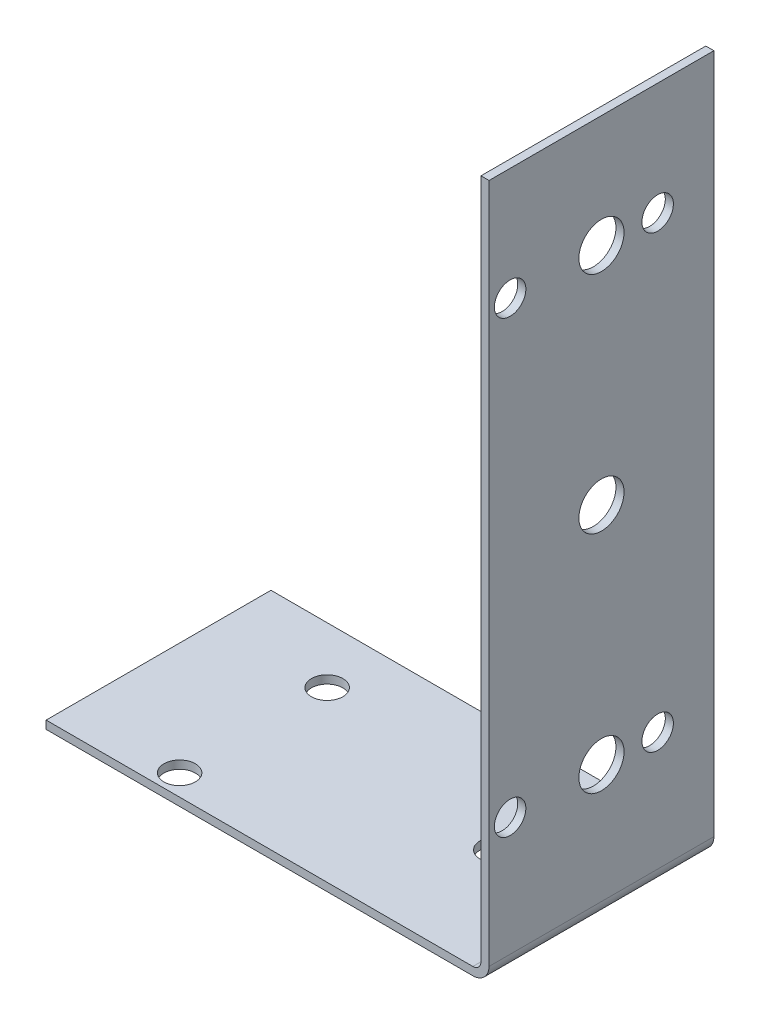
ISO-10303-21;
HEADER;
FILE_DESCRIPTION(('STEP AP214'),'2;1');
FILE_NAME('part.step','',(''),(''),'','','');
FILE_SCHEMA(('AUTOMOTIVE_DESIGN { 1 0 10303 214 1 1 1 1 }'));
ENDSEC;
DATA;
#1=APPLICATION_CONTEXT('core data for automotive mechanical design processes');
#2=APPLICATION_PROTOCOL_DEFINITION('international standard','automotive_design',2000,#1);
#3=PRODUCT_CONTEXT('',#1,'mechanical');
#4=PRODUCT('Part','Part','',(#3));
#5=PRODUCT_RELATED_PRODUCT_CATEGORY('part','',(#4));
#6=PRODUCT_DEFINITION_FORMATION('','',#4);
#7=PRODUCT_DEFINITION_CONTEXT('part definition',#1,'design');
#8=PRODUCT_DEFINITION('design','',#6,#7);
#9=PRODUCT_DEFINITION_SHAPE('','',#8);
#10=(LENGTH_UNIT() NAMED_UNIT(*) SI_UNIT(.MILLI.,.METRE.));
#11=(NAMED_UNIT(*) PLANE_ANGLE_UNIT() SI_UNIT($,.RADIAN.));
#12=(NAMED_UNIT(*) SI_UNIT($,.STERADIAN.) SOLID_ANGLE_UNIT());
#13=UNCERTAINTY_MEASURE_WITH_UNIT(LENGTH_MEASURE(1.E-05),#10,'distance_accuracy_value','');
#14=(GEOMETRIC_REPRESENTATION_CONTEXT(3) GLOBAL_UNCERTAINTY_ASSIGNED_CONTEXT((#13)) GLOBAL_UNIT_ASSIGNED_CONTEXT((#10,
#11,#12)) REPRESENTATION_CONTEXT('',''));
#15=CARTESIAN_POINT('',(0.,0.,0.));
#16=DIRECTION('',(0.,0.,1.));
#17=DIRECTION('',(1.,0.,0.));
#18=AXIS2_PLACEMENT_3D('',#15,#16,#17);
#19=CARTESIAN_POINT('',(0.,0.9144,0.));
#20=DIRECTION('',(0.,1.,0.));
#21=DIRECTION('',(0.,0.,1.));
#22=AXIS2_PLACEMENT_3D('',#19,#20,#21);
#23=PLANE('',#22);
#24=CARTESIAN_POINT('',(-25.4,0.9144,-26.9875));
#25=DIRECTION('',(0.,1.,0.));
#26=DIRECTION('',(0.,0.,1.));
#27=AXIS2_PLACEMENT_3D('',#24,#25,#26);
#28=CIRCLE('',#27,1.778);
#29=CARTESIAN_POINT('',(-25.4,0.9144,-25.2095));
#30=VERTEX_POINT('',#29);
#31=EDGE_CURVE('E111',#30,#30,#28,.F.);
#32=ORIENTED_EDGE('',*,*,#31,.T.);
#33=EDGE_LOOP('',(#32));
#34=FACE_BOUND('',#33,.T.);
#35=CARTESIAN_POINT('',(-50.8,0.9144,-16.66875));
#36=DIRECTION('',(0.,1.,0.));
#37=DIRECTION('',(0.,0.,1.));
#38=AXIS2_PLACEMENT_3D('',#35,#36,#37);
#39=CIRCLE('',#38,1.778);
#40=CARTESIAN_POINT('',(-50.8,0.9144,-14.89075));
#41=VERTEX_POINT('',#40);
#42=EDGE_CURVE('E118',#41,#41,#39,.F.);
#43=ORIENTED_EDGE('',*,*,#42,.T.);
#44=EDGE_LOOP('',(#43));
#45=FACE_BOUND('',#44,.T.);
#46=CARTESIAN_POINT('',(-50.8,0.9144,-33.3375));
#47=DIRECTION('',(0.,1.,0.));
#48=DIRECTION('',(0.,0.,1.));
#49=AXIS2_PLACEMENT_3D('',#46,#47,#48);
#50=CIRCLE('',#49,1.778);
#51=CARTESIAN_POINT('',(-50.8,0.9144,-31.5595));
#52=VERTEX_POINT('',#51);
#53=EDGE_CURVE('E19',#52,#52,#50,.F.);
#54=ORIENTED_EDGE('',*,*,#53,.T.);
#55=EDGE_LOOP('',(#54));
#56=FACE_BOUND('',#55,.T.);
#57=DIRECTION('',(-1.,0.,0.));
#58=VECTOR('',#57,1.);
#59=CARTESIAN_POINT('',(0.,0.9144,-14.2875));
#60=LINE('',#59,#58);
#61=CARTESIAN_POINT('',(-63.5,0.9144,-14.2875));
#62=VERTEX_POINT('',#61);
#63=CARTESIAN_POINT('',(-15.2908,0.9144,-14.2875));
#64=VERTEX_POINT('',#63);
#65=EDGE_CURVE('E123',#62,#64,#60,.F.);
#66=ORIENTED_EDGE('',*,*,#65,.T.);
#67=DIRECTION('',(0.,0.,-1.));
#68=VECTOR('',#67,1.);
#69=CARTESIAN_POINT('',(-15.2908,0.9144,-14.2875));
#70=LINE('',#69,#68);
#71=CARTESIAN_POINT('',(-15.2908,0.9144,-39.6875));
#72=VERTEX_POINT('',#71);
#73=EDGE_CURVE('E80',#64,#72,#70,.T.);
#74=ORIENTED_EDGE('',*,*,#73,.T.);
#75=DIRECTION('',(1.,0.,0.));
#76=VECTOR('',#75,1.);
#77=CARTESIAN_POINT('',(0.,0.9144,-39.6875));
#78=LINE('',#77,#76);
#79=CARTESIAN_POINT('',(-63.5,0.9144,-39.6875));
#80=VERTEX_POINT('',#79);
#81=EDGE_CURVE('E140',#72,#80,#78,.F.);
#82=ORIENTED_EDGE('',*,*,#81,.T.);
#83=DIRECTION('',(0.,0.,-1.));
#84=VECTOR('',#83,1.);
#85=CARTESIAN_POINT('',(-63.5,0.9144,-26.9875));
#86=LINE('',#85,#84);
#87=EDGE_CURVE('E130',#80,#62,#86,.F.);
#88=ORIENTED_EDGE('',*,*,#87,.T.);
#89=EDGE_LOOP('',(#66,#74,#82,#88));
#90=FACE_BOUND('',#89,.T.);
#91=ADVANCED_FACE('F16',(#34,#45,#56,#90),#23,.T.);
#92=CARTESIAN_POINT('',(-63.5,0.4572,-26.9875));
#93=DIRECTION('',(1.,0.,0.));
#94=DIRECTION('',(0.,0.,-1.));
#95=AXIS2_PLACEMENT_3D('',#92,#93,#94);
#96=PLANE('',#95);
#97=ORIENTED_EDGE('',*,*,#87,.F.);
#98=DIRECTION('',(0.,1.,0.));
#99=VECTOR('',#98,1.);
#100=CARTESIAN_POINT('',(-63.5,0.4572,-39.6875));
#101=LINE('',#100,#99);
#102=CARTESIAN_POINT('',(-63.5,0.,-39.6875));
#103=VERTEX_POINT('',#102);
#104=EDGE_CURVE('E137',#103,#80,#101,.T.);
#105=ORIENTED_EDGE('',*,*,#104,.F.);
#106=DIRECTION('',(0.,0.,1.));
#107=VECTOR('',#106,1.);
#108=CARTESIAN_POINT('',(-63.5,0.,0.));
#109=LINE('',#108,#107);
#110=CARTESIAN_POINT('',(-63.5,0.,-14.2875));
#111=VERTEX_POINT('',#110);
#112=EDGE_CURVE('E109',#103,#111,#109,.T.);
#113=ORIENTED_EDGE('',*,*,#112,.T.);
#114=DIRECTION('',(0.,1.,0.));
#115=VECTOR('',#114,1.);
#116=CARTESIAN_POINT('',(-63.5,0.4572,-14.2875));
#117=LINE('',#116,#115);
#118=EDGE_CURVE('E126',#111,#62,#117,.T.);
#119=ORIENTED_EDGE('',*,*,#118,.T.);
#120=EDGE_LOOP('',(#97,#105,#113,#119));
#121=FACE_BOUND('',#120,.T.);
#122=ADVANCED_FACE('F224',(#121),#96,.F.);
#123=CARTESIAN_POINT('',(-50.8,0.4572,-33.3375));
#124=DIRECTION('',(0.,1.,0.));
#125=DIRECTION('',(0.,0.,1.));
#126=AXIS2_PLACEMENT_3D('',#123,#124,#125);
#127=CYLINDRICAL_SURFACE('',#126,1.778);
#128=ORIENTED_EDGE('',*,*,#53,.F.);
#129=EDGE_LOOP('',(#128));
#130=FACE_BOUND('',#129,.T.);
#131=CARTESIAN_POINT('',(-50.8,0.,-33.3375));
#132=DIRECTION('',(0.,1.,0.));
#133=DIRECTION('',(0.,0.,1.));
#134=AXIS2_PLACEMENT_3D('',#131,#132,#133);
#135=CIRCLE('',#134,1.778);
#136=CARTESIAN_POINT('',(-50.8,0.,-31.5595));
#137=VERTEX_POINT('',#136);
#138=EDGE_CURVE('E115',#137,#137,#135,.F.);
#139=ORIENTED_EDGE('',*,*,#138,.T.);
#140=EDGE_LOOP('',(#139));
#141=FACE_BOUND('',#140,.T.);
#142=ADVANCED_FACE('F317',(#130,#141),#127,.F.);
#143=CARTESIAN_POINT('',(-50.8,0.4572,-16.66875));
#144=DIRECTION('',(0.,1.,0.));
#145=DIRECTION('',(0.,0.,1.));
#146=AXIS2_PLACEMENT_3D('',#143,#144,#145);
#147=CYLINDRICAL_SURFACE('',#146,1.778);
#148=ORIENTED_EDGE('',*,*,#42,.F.);
#149=EDGE_LOOP('',(#148));
#150=FACE_BOUND('',#149,.T.);
#151=CARTESIAN_POINT('',(-50.8,0.,-16.66875));
#152=DIRECTION('',(0.,1.,0.));
#153=DIRECTION('',(0.,0.,1.));
#154=AXIS2_PLACEMENT_3D('',#151,#152,#153);
#155=CIRCLE('',#154,1.778);
#156=CARTESIAN_POINT('',(-50.8,0.,-14.89075));
#157=VERTEX_POINT('',#156);
#158=EDGE_CURVE('E190',#157,#157,#155,.F.);
#159=ORIENTED_EDGE('',*,*,#158,.T.);
#160=EDGE_LOOP('',(#159));
#161=FACE_BOUND('',#160,.T.);
#162=ADVANCED_FACE('F313',(#150,#161),#147,.F.);
#163=CARTESIAN_POINT('',(-25.4,0.4572,-26.9875));
#164=DIRECTION('',(0.,1.,0.));
#165=DIRECTION('',(0.,0.,1.));
#166=AXIS2_PLACEMENT_3D('',#163,#164,#165);
#167=CYLINDRICAL_SURFACE('',#166,1.778);
#168=ORIENTED_EDGE('',*,*,#31,.F.);
#169=EDGE_LOOP('',(#168));
#170=FACE_BOUND('',#169,.T.);
#171=CARTESIAN_POINT('',(-25.4,0.,-26.9875));
#172=DIRECTION('',(0.,1.,0.));
#173=DIRECTION('',(0.,0.,1.));
#174=AXIS2_PLACEMENT_3D('',#171,#172,#173);
#175=CIRCLE('',#174,1.778);
#176=CARTESIAN_POINT('',(-25.4,0.,-25.2095));
#177=VERTEX_POINT('',#176);
#178=EDGE_CURVE('E188',#177,#177,#175,.F.);
#179=ORIENTED_EDGE('',*,*,#178,.T.);
#180=EDGE_LOOP('',(#179));
#181=FACE_BOUND('',#180,.T.);
#182=ADVANCED_FACE('F310',(#170,#181),#167,.F.);
#183=CARTESIAN_POINT('',(-15.2908,1.8288,-14.2875));
#184=DIRECTION('',(0.,0.,-1.));
#185=DIRECTION('',(-1.,0.,0.));
#186=AXIS2_PLACEMENT_3D('',#183,#184,#185);
#187=CYLINDRICAL_SURFACE('',#186,0.9144);
#188=ORIENTED_EDGE('',*,*,#73,.F.);
#189=CARTESIAN_POINT('',(-15.2908,1.8288,-14.2875));
#190=DIRECTION('',(0.,0.,-1.));
#191=DIRECTION('',(-1.,0.,0.));
#192=AXIS2_PLACEMENT_3D('',#189,#190,#191);
#193=CIRCLE('',#192,0.9144);
#194=CARTESIAN_POINT('',(-14.3764,1.8288,-14.2875));
#195=VERTEX_POINT('',#194);
#196=EDGE_CURVE('E90',#64,#195,#193,.F.);
#197=ORIENTED_EDGE('',*,*,#196,.T.);
#198=DIRECTION('',(0.,0.,1.));
#199=VECTOR('',#198,1.);
#200=CARTESIAN_POINT('',(-14.3764,1.8288,0.));
#201=LINE('',#200,#199);
#202=CARTESIAN_POINT('',(-14.3764,1.8288,-39.6875));
#203=VERTEX_POINT('',#202);
#204=EDGE_CURVE('E99',#203,#195,#201,.T.);
#205=ORIENTED_EDGE('',*,*,#204,.F.);
#206=CARTESIAN_POINT('',(-15.2908,1.8288,-39.6875));
#207=DIRECTION('',(0.,0.,-1.));
#208=DIRECTION('',(-1.,0.,0.));
#209=AXIS2_PLACEMENT_3D('',#206,#207,#208);
#210=CIRCLE('',#209,0.9144);
#211=EDGE_CURVE('E103',#203,#72,#210,.T.);
#212=ORIENTED_EDGE('',*,*,#211,.T.);
#213=EDGE_LOOP('',(#188,#197,#205,#212));
#214=FACE_BOUND('',#213,.T.);
#215=ADVANCED_FACE('F105',(#214),#187,.F.);
#216=CARTESIAN_POINT('',(0.,0.,0.));
#217=DIRECTION('',(0.,1.,0.));
#218=DIRECTION('',(0.,0.,1.));
#219=AXIS2_PLACEMENT_3D('',#216,#217,#218);
#220=PLANE('',#219);
#221=ORIENTED_EDGE('',*,*,#178,.F.);
#222=EDGE_LOOP('',(#221));
#223=FACE_BOUND('',#222,.T.);
#224=ORIENTED_EDGE('',*,*,#158,.F.);
#225=EDGE_LOOP('',(#224));
#226=FACE_BOUND('',#225,.T.);
#227=ORIENTED_EDGE('',*,*,#138,.F.);
#228=EDGE_LOOP('',(#227));
#229=FACE_BOUND('',#228,.T.);
#230=ORIENTED_EDGE('',*,*,#112,.F.);
#231=DIRECTION('',(1.,0.,0.));
#232=VECTOR('',#231,1.);
#233=CARTESIAN_POINT('',(0.,0.,-39.6875));
#234=LINE('',#233,#232);
#235=CARTESIAN_POINT('',(-15.2908,0.,-39.6875));
#236=VERTEX_POINT('',#235);
#237=EDGE_CURVE('E106',#236,#103,#234,.F.);
#238=ORIENTED_EDGE('',*,*,#237,.F.);
#239=DIRECTION('',(0.,0.,-1.));
#240=VECTOR('',#239,1.);
#241=CARTESIAN_POINT('',(-15.2908,0.,-14.2875));
#242=LINE('',#241,#240);
#243=CARTESIAN_POINT('',(-15.2908,0.,-14.2875));
#244=VERTEX_POINT('',#243);
#245=EDGE_CURVE('E185',#244,#236,#242,.T.);
#246=ORIENTED_EDGE('',*,*,#245,.F.);
#247=DIRECTION('',(1.,0.,0.));
#248=VECTOR('',#247,1.);
#249=CARTESIAN_POINT('',(0.,0.,-14.2875));
#250=LINE('',#249,#248);
#251=EDGE_CURVE('E195',#111,#244,#250,.T.);
#252=ORIENTED_EDGE('',*,*,#251,.F.);
#253=EDGE_LOOP('',(#230,#238,#246,#252));
#254=FACE_BOUND('',#253,.T.);
#255=ADVANCED_FACE('F226',(#223,#226,#229,#254),#220,.F.);
#256=CARTESIAN_POINT('',(-14.3764,15.2260638387792,0.));
#257=DIRECTION('',(-1.,0.,0.));
#258=DIRECTION('',(0.,0.,1.));
#259=AXIS2_PLACEMENT_3D('',#256,#257,#258);
#260=PLANE('',#259);
#261=CARTESIAN_POINT('',(-14.3764,66.026063838769,-26.9875));
#262=DIRECTION('',(-1.,0.,0.));
#263=DIRECTION('',(0.,0.,1.));
#264=AXIS2_PLACEMENT_3D('',#261,#262,#263);
#265=CIRCLE('',#264,2.5527);
#266=CARTESIAN_POINT('',(-14.3764,66.026063838769,-24.4348));
#267=VERTEX_POINT('',#266);
#268=EDGE_CURVE('E169',#267,#267,#265,.F.);
#269=ORIENTED_EDGE('',*,*,#268,.T.);
#270=EDGE_LOOP('',(#269));
#271=FACE_BOUND('',#270,.T.);
#272=CARTESIAN_POINT('',(-14.3764,40.626063838769,-26.9875));
#273=DIRECTION('',(-1.,0.,0.));
#274=DIRECTION('',(0.,0.,1.));
#275=AXIS2_PLACEMENT_3D('',#272,#273,#274);
#276=CIRCLE('',#275,2.5527);
#277=CARTESIAN_POINT('',(-14.3764,40.626063838769,-24.4348));
#278=VERTEX_POINT('',#277);
#279=EDGE_CURVE('E166',#278,#278,#276,.F.);
#280=ORIENTED_EDGE('',*,*,#279,.T.);
#281=EDGE_LOOP('',(#280));
#282=FACE_BOUND('',#281,.T.);
#283=CARTESIAN_POINT('',(-14.3764,15.2260638387792,-26.9875));
#284=DIRECTION('',(-1.,0.,0.));
#285=DIRECTION('',(0.,0.,1.));
#286=AXIS2_PLACEMENT_3D('',#283,#284,#285);
#287=CIRCLE('',#286,2.5527);
#288=CARTESIAN_POINT('',(-14.3764,15.2260638387792,-24.4348));
#289=VERTEX_POINT('',#288);
#290=EDGE_CURVE('E162',#289,#289,#287,.F.);
#291=ORIENTED_EDGE('',*,*,#290,.T.);
#292=EDGE_LOOP('',(#291));
#293=FACE_BOUND('',#292,.T.);
#294=CARTESIAN_POINT('',(-14.3764,66.026063838769,-16.66875));
#295=DIRECTION('',(-1.,0.,0.));
#296=DIRECTION('',(0.,0.,1.));
#297=AXIS2_PLACEMENT_3D('',#294,#295,#296);
#298=CIRCLE('',#297,1.778);
#299=CARTESIAN_POINT('',(-14.3764,66.026063838769,-14.89075));
#300=VERTEX_POINT('',#299);
#301=EDGE_CURVE('E172',#300,#300,#298,.F.);
#302=ORIENTED_EDGE('',*,*,#301,.T.);
#303=EDGE_LOOP('',(#302));
#304=FACE_BOUND('',#303,.T.);
#305=CARTESIAN_POINT('',(-14.3764,15.2260638387792,-16.66875));
#306=DIRECTION('',(-1.,0.,0.));
#307=DIRECTION('',(0.,0.,1.));
#308=AXIS2_PLACEMENT_3D('',#305,#306,#307);
#309=CIRCLE('',#308,1.778);
#310=CARTESIAN_POINT('',(-14.3764,15.2260638387792,-14.89075));
#311=VERTEX_POINT('',#310);
#312=EDGE_CURVE('E175',#311,#311,#309,.F.);
#313=ORIENTED_EDGE('',*,*,#312,.T.);
#314=EDGE_LOOP('',(#313));
#315=FACE_BOUND('',#314,.T.);
#316=CARTESIAN_POINT('',(-14.3764,66.026063838769,-33.3375));
#317=DIRECTION('',(-1.,0.,0.));
#318=DIRECTION('',(0.,0.,1.));
#319=AXIS2_PLACEMENT_3D('',#316,#317,#318);
#320=CIRCLE('',#319,1.778);
#321=CARTESIAN_POINT('',(-14.3764,66.026063838769,-31.5595));
#322=VERTEX_POINT('',#321);
#323=EDGE_CURVE('E178',#322,#322,#320,.F.);
#324=ORIENTED_EDGE('',*,*,#323,.T.);
#325=EDGE_LOOP('',(#324));
#326=FACE_BOUND('',#325,.T.);
#327=CARTESIAN_POINT('',(-14.3764,15.2260638387792,-33.3375));
#328=DIRECTION('',(-1.,0.,0.));
#329=DIRECTION('',(0.,0.,1.));
#330=AXIS2_PLACEMENT_3D('',#327,#328,#329);
#331=CIRCLE('',#330,1.778);
#332=CARTESIAN_POINT('',(-14.3764,15.2260638387792,-31.5595));
#333=VERTEX_POINT('',#332);
#334=EDGE_CURVE('E181',#333,#333,#331,.F.);
#335=ORIENTED_EDGE('',*,*,#334,.T.);
#336=EDGE_LOOP('',(#335));
#337=FACE_BOUND('',#336,.T.);
#338=DIRECTION('',(0.,1.,0.));
#339=VECTOR('',#338,1.);
#340=CARTESIAN_POINT('',(-14.3764,15.2260638387792,-39.6875));
#341=LINE('',#340,#339);
#342=CARTESIAN_POINT('',(-14.3764,78.726063838769,-39.6875));
#343=VERTEX_POINT('',#342);
#344=EDGE_CURVE('E101',#343,#203,#341,.F.);
#345=ORIENTED_EDGE('',*,*,#344,.T.);
#346=ORIENTED_EDGE('',*,*,#204,.T.);
#347=DIRECTION('',(0.,1.,0.));
#348=VECTOR('',#347,1.);
#349=CARTESIAN_POINT('',(-14.3764,15.2260638387792,-14.2875));
#350=LINE('',#349,#348);
#351=CARTESIAN_POINT('',(-14.3764,78.726063838769,-14.2875));
#352=VERTEX_POINT('',#351);
#353=EDGE_CURVE('E86',#195,#352,#350,.T.);
#354=ORIENTED_EDGE('',*,*,#353,.T.);
#355=DIRECTION('',(0.,0.,-1.));
#356=VECTOR('',#355,1.);
#357=CARTESIAN_POINT('',(-14.3764,78.726063838769,-26.9875));
#358=LINE('',#357,#356);
#359=EDGE_CURVE('E240',#352,#343,#358,.T.);
#360=ORIENTED_EDGE('',*,*,#359,.T.);
#361=EDGE_LOOP('',(#345,#346,#354,#360));
#362=FACE_BOUND('',#361,.T.);
#363=ADVANCED_FACE('F100',(#271,#282,#293,#304,#315,#326,#337,#362),#260,.T.);
#364=CARTESIAN_POINT('',(-15.2908,1.8288,-14.2875));
#365=DIRECTION('',(0.,0.,-1.));
#366=DIRECTION('',(-1.,0.,0.));
#367=AXIS2_PLACEMENT_3D('',#364,#365,#366);
#368=CYLINDRICAL_SURFACE('',#367,1.8288);
#369=CARTESIAN_POINT('',(-15.2908,1.8288,-39.6875));
#370=DIRECTION('',(0.,0.,-1.));
#371=DIRECTION('',(-1.,0.,0.));
#372=AXIS2_PLACEMENT_3D('',#369,#370,#371);
#373=CIRCLE('',#372,1.8288);
#374=CARTESIAN_POINT('',(-13.462,1.8288,-39.6875));
#375=VERTEX_POINT('',#374);
#376=EDGE_CURVE('E95',#236,#375,#373,.F.);
#377=ORIENTED_EDGE('',*,*,#376,.T.);
#378=DIRECTION('',(0.,0.,1.));
#379=VECTOR('',#378,1.);
#380=CARTESIAN_POINT('',(-13.462,1.8288,0.));
#381=LINE('',#380,#379);
#382=CARTESIAN_POINT('',(-13.462,1.8288,-14.2875));
#383=VERTEX_POINT('',#382);
#384=EDGE_CURVE('E165',#375,#383,#381,.T.);
#385=ORIENTED_EDGE('',*,*,#384,.T.);
#386=CARTESIAN_POINT('',(-15.2908,1.8288,-14.2875));
#387=DIRECTION('',(0.,0.,-1.));
#388=DIRECTION('',(-1.,0.,0.));
#389=AXIS2_PLACEMENT_3D('',#386,#387,#388);
#390=CIRCLE('',#389,1.8288);
#391=EDGE_CURVE('E102',#383,#244,#390,.T.);
#392=ORIENTED_EDGE('',*,*,#391,.T.);
#393=ORIENTED_EDGE('',*,*,#245,.T.);
#394=EDGE_LOOP('',(#377,#385,#392,#393));
#395=FACE_BOUND('',#394,.T.);
#396=ADVANCED_FACE('F251',(#395),#368,.T.);
#397=CARTESIAN_POINT('',(-13.9192,15.2260638387792,-14.2875));
#398=DIRECTION('',(0.,0.,-1.));
#399=DIRECTION('',(-1.,0.,0.));
#400=AXIS2_PLACEMENT_3D('',#397,#398,#399);
#401=PLANE('',#400);
#402=DIRECTION('',(1.,0.,0.));
#403=VECTOR('',#402,1.);
#404=CARTESIAN_POINT('',(-13.9192,78.726063838769,-14.2875));
#405=LINE('',#404,#403);
#406=CARTESIAN_POINT('',(-13.462,78.726063838769,-14.2875));
#407=VERTEX_POINT('',#406);
#408=EDGE_CURVE('E92',#407,#352,#405,.F.);
#409=ORIENTED_EDGE('',*,*,#408,.T.);
#410=ORIENTED_EDGE('',*,*,#353,.F.);
#411=ORIENTED_EDGE('',*,*,#196,.F.);
#412=ORIENTED_EDGE('',*,*,#65,.F.);
#413=ORIENTED_EDGE('',*,*,#118,.F.);
#414=ORIENTED_EDGE('',*,*,#251,.T.);
#415=ORIENTED_EDGE('',*,*,#391,.F.);
#416=DIRECTION('',(0.,1.,0.));
#417=VECTOR('',#416,1.);
#418=CARTESIAN_POINT('',(-13.462,15.2260638387792,-14.2875));
#419=LINE('',#418,#417);
#420=EDGE_CURVE('E209',#383,#407,#419,.T.);
#421=ORIENTED_EDGE('',*,*,#420,.T.);
#422=EDGE_LOOP('',(#409,#410,#411,#412,#413,#414,#415,#421));
#423=FACE_BOUND('',#422,.T.);
#424=ADVANCED_FACE('F88',(#423),#401,.F.);
#425=CARTESIAN_POINT('',(-13.9192,78.726063838769,-26.9875));
#426=DIRECTION('',(0.,-1.,0.));
#427=DIRECTION('',(0.,0.,-1.));
#428=AXIS2_PLACEMENT_3D('',#425,#426,#427);
#429=PLANE('',#428);
#430=ORIENTED_EDGE('',*,*,#359,.F.);
#431=ORIENTED_EDGE('',*,*,#408,.F.);
#432=DIRECTION('',(0.,0.,1.));
#433=VECTOR('',#432,1.);
#434=CARTESIAN_POINT('',(-13.462,78.726063838769,0.));
#435=LINE('',#434,#433);
#436=CARTESIAN_POINT('',(-13.462,78.726063838769,-39.6875));
#437=VERTEX_POINT('',#436);
#438=EDGE_CURVE('E210',#407,#437,#435,.F.);
#439=ORIENTED_EDGE('',*,*,#438,.T.);
#440=DIRECTION('',(1.,0.,0.));
#441=VECTOR('',#440,1.);
#442=CARTESIAN_POINT('',(-13.9192,78.726063838769,-39.6875));
#443=LINE('',#442,#441);
#444=EDGE_CURVE('E34',#437,#343,#443,.F.);
#445=ORIENTED_EDGE('',*,*,#444,.T.);
#446=EDGE_LOOP('',(#430,#431,#439,#445));
#447=FACE_BOUND('',#446,.T.);
#448=ADVANCED_FACE('F241',(#447),#429,.F.);
#449=CARTESIAN_POINT('',(-13.9192,15.2260638387792,-39.6875));
#450=DIRECTION('',(0.,0.,1.));
#451=DIRECTION('',(1.,0.,0.));
#452=AXIS2_PLACEMENT_3D('',#449,#450,#451);
#453=PLANE('',#452);
#454=ORIENTED_EDGE('',*,*,#444,.F.);
#455=DIRECTION('',(0.,1.,0.));
#456=VECTOR('',#455,1.);
#457=CARTESIAN_POINT('',(-13.462,15.2260638387792,-39.6875));
#458=LINE('',#457,#456);
#459=EDGE_CURVE('E161',#437,#375,#458,.F.);
#460=ORIENTED_EDGE('',*,*,#459,.T.);
#461=ORIENTED_EDGE('',*,*,#376,.F.);
#462=ORIENTED_EDGE('',*,*,#237,.T.);
#463=ORIENTED_EDGE('',*,*,#104,.T.);
#464=ORIENTED_EDGE('',*,*,#81,.F.);
#465=ORIENTED_EDGE('',*,*,#211,.F.);
#466=ORIENTED_EDGE('',*,*,#344,.F.);
#467=EDGE_LOOP('',(#454,#460,#461,#462,#463,#464,#465,#466));
#468=FACE_BOUND('',#467,.T.);
#469=ADVANCED_FACE('F219',(#468),#453,.F.);
#470=CARTESIAN_POINT('',(-13.9192,15.2260638387792,-33.3375));
#471=DIRECTION('',(-1.,0.,0.));
#472=DIRECTION('',(0.,0.,1.));
#473=AXIS2_PLACEMENT_3D('',#470,#471,#472);
#474=CYLINDRICAL_SURFACE('',#473,1.778);
#475=ORIENTED_EDGE('',*,*,#334,.F.);
#476=EDGE_LOOP('',(#475));
#477=FACE_BOUND('',#476,.T.);
#478=CARTESIAN_POINT('',(-13.462,15.2260638387792,-33.3375));
#479=DIRECTION('',(-1.,0.,0.));
#480=DIRECTION('',(0.,0.,1.));
#481=AXIS2_PLACEMENT_3D('',#478,#479,#480);
#482=CIRCLE('',#481,1.778);
#483=CARTESIAN_POINT('',(-13.462,15.2260638387792,-31.5595));
#484=VERTEX_POINT('',#483);
#485=EDGE_CURVE('E158',#484,#484,#482,.F.);
#486=ORIENTED_EDGE('',*,*,#485,.T.);
#487=EDGE_LOOP('',(#486));
#488=FACE_BOUND('',#487,.T.);
#489=ADVANCED_FACE('F249',(#477,#488),#474,.F.);
#490=CARTESIAN_POINT('',(-13.9192,66.026063838769,-33.3375));
#491=DIRECTION('',(-1.,0.,0.));
#492=DIRECTION('',(0.,0.,1.));
#493=AXIS2_PLACEMENT_3D('',#490,#491,#492);
#494=CYLINDRICAL_SURFACE('',#493,1.778);
#495=ORIENTED_EDGE('',*,*,#323,.F.);
#496=EDGE_LOOP('',(#495));
#497=FACE_BOUND('',#496,.T.);
#498=CARTESIAN_POINT('',(-13.462,66.026063838769,-33.3375));
#499=DIRECTION('',(-1.,0.,0.));
#500=DIRECTION('',(0.,0.,1.));
#501=AXIS2_PLACEMENT_3D('',#498,#499,#500);
#502=CIRCLE('',#501,1.778);
#503=CARTESIAN_POINT('',(-13.462,66.026063838769,-31.5595));
#504=VERTEX_POINT('',#503);
#505=EDGE_CURVE('E155',#504,#504,#502,.F.);
#506=ORIENTED_EDGE('',*,*,#505,.T.);
#507=EDGE_LOOP('',(#506));
#508=FACE_BOUND('',#507,.T.);
#509=ADVANCED_FACE('F281',(#497,#508),#494,.F.);
#510=CARTESIAN_POINT('',(-13.9192,15.2260638387792,-16.66875));
#511=DIRECTION('',(-1.,0.,0.));
#512=DIRECTION('',(0.,0.,1.));
#513=AXIS2_PLACEMENT_3D('',#510,#511,#512);
#514=CYLINDRICAL_SURFACE('',#513,1.778);
#515=ORIENTED_EDGE('',*,*,#312,.F.);
#516=EDGE_LOOP('',(#515));
#517=FACE_BOUND('',#516,.T.);
#518=CARTESIAN_POINT('',(-13.462,15.2260638387792,-16.66875));
#519=DIRECTION('',(-1.,0.,0.));
#520=DIRECTION('',(0.,0.,1.));
#521=AXIS2_PLACEMENT_3D('',#518,#519,#520);
#522=CIRCLE('',#521,1.778);
#523=CARTESIAN_POINT('',(-13.462,15.2260638387792,-14.89075));
#524=VERTEX_POINT('',#523);
#525=EDGE_CURVE('E152',#524,#524,#522,.F.);
#526=ORIENTED_EDGE('',*,*,#525,.T.);
#527=EDGE_LOOP('',(#526));
#528=FACE_BOUND('',#527,.T.);
#529=ADVANCED_FACE('F277',(#517,#528),#514,.F.);
#530=CARTESIAN_POINT('',(-13.9192,66.026063838769,-16.66875));
#531=DIRECTION('',(-1.,0.,0.));
#532=DIRECTION('',(0.,0.,1.));
#533=AXIS2_PLACEMENT_3D('',#530,#531,#532);
#534=CYLINDRICAL_SURFACE('',#533,1.778);
#535=ORIENTED_EDGE('',*,*,#301,.F.);
#536=EDGE_LOOP('',(#535));
#537=FACE_BOUND('',#536,.T.);
#538=CARTESIAN_POINT('',(-13.462,66.026063838769,-16.66875));
#539=DIRECTION('',(-1.,0.,0.));
#540=DIRECTION('',(0.,0.,1.));
#541=AXIS2_PLACEMENT_3D('',#538,#539,#540);
#542=CIRCLE('',#541,1.778);
#543=CARTESIAN_POINT('',(-13.462,66.026063838769,-14.89075));
#544=VERTEX_POINT('',#543);
#545=EDGE_CURVE('E149',#544,#544,#542,.F.);
#546=ORIENTED_EDGE('',*,*,#545,.T.);
#547=EDGE_LOOP('',(#546));
#548=FACE_BOUND('',#547,.T.);
#549=ADVANCED_FACE('F273',(#537,#548),#534,.F.);
#550=CARTESIAN_POINT('',(-13.9192,66.026063838769,-26.9875));
#551=DIRECTION('',(-1.,0.,0.));
#552=DIRECTION('',(0.,0.,1.));
#553=AXIS2_PLACEMENT_3D('',#550,#551,#552);
#554=CYLINDRICAL_SURFACE('',#553,2.5527);
#555=ORIENTED_EDGE('',*,*,#268,.F.);
#556=EDGE_LOOP('',(#555));
#557=FACE_BOUND('',#556,.T.);
#558=CARTESIAN_POINT('',(-13.462,66.026063838769,-26.9875));
#559=DIRECTION('',(-1.,0.,0.));
#560=DIRECTION('',(0.,0.,1.));
#561=AXIS2_PLACEMENT_3D('',#558,#559,#560);
#562=CIRCLE('',#561,2.5527);
#563=CARTESIAN_POINT('',(-13.462,66.026063838769,-24.4348));
#564=VERTEX_POINT('',#563);
#565=EDGE_CURVE('E146',#564,#564,#562,.F.);
#566=ORIENTED_EDGE('',*,*,#565,.T.);
#567=EDGE_LOOP('',(#566));
#568=FACE_BOUND('',#567,.T.);
#569=ADVANCED_FACE('F269',(#557,#568),#554,.F.);
#570=CARTESIAN_POINT('',(-13.9192,40.626063838769,-26.9875));
#571=DIRECTION('',(-1.,0.,0.));
#572=DIRECTION('',(0.,0.,1.));
#573=AXIS2_PLACEMENT_3D('',#570,#571,#572);
#574=CYLINDRICAL_SURFACE('',#573,2.5527);
#575=ORIENTED_EDGE('',*,*,#279,.F.);
#576=EDGE_LOOP('',(#575));
#577=FACE_BOUND('',#576,.T.);
#578=CARTESIAN_POINT('',(-13.462,40.626063838769,-26.9875));
#579=DIRECTION('',(-1.,0.,0.));
#580=DIRECTION('',(0.,0.,1.));
#581=AXIS2_PLACEMENT_3D('',#578,#579,#580);
#582=CIRCLE('',#581,2.5527);
#583=CARTESIAN_POINT('',(-13.462,40.626063838769,-24.4348));
#584=VERTEX_POINT('',#583);
#585=EDGE_CURVE('E25',#584,#584,#582,.F.);
#586=ORIENTED_EDGE('',*,*,#585,.T.);
#587=EDGE_LOOP('',(#586));
#588=FACE_BOUND('',#587,.T.);
#589=ADVANCED_FACE('F261',(#577,#588),#574,.F.);
#590=CARTESIAN_POINT('',(-13.9192,15.2260638387792,-26.9875));
#591=DIRECTION('',(-1.,0.,0.));
#592=DIRECTION('',(0.,0.,1.));
#593=AXIS2_PLACEMENT_3D('',#590,#591,#592);
#594=CYLINDRICAL_SURFACE('',#593,2.5527);
#595=ORIENTED_EDGE('',*,*,#290,.F.);
#596=EDGE_LOOP('',(#595));
#597=FACE_BOUND('',#596,.T.);
#598=CARTESIAN_POINT('',(-13.462,15.2260638387792,-26.9875));
#599=DIRECTION('',(-1.,0.,0.));
#600=DIRECTION('',(0.,0.,1.));
#601=AXIS2_PLACEMENT_3D('',#598,#599,#600);
#602=CIRCLE('',#601,2.5527);
#603=CARTESIAN_POINT('',(-13.462,15.2260638387792,-24.4348));
#604=VERTEX_POINT('',#603);
#605=EDGE_CURVE('E11',#604,#604,#602,.F.);
#606=ORIENTED_EDGE('',*,*,#605,.T.);
#607=EDGE_LOOP('',(#606));
#608=FACE_BOUND('',#607,.T.);
#609=ADVANCED_FACE('F255',(#597,#608),#594,.F.);
#610=CARTESIAN_POINT('',(-13.462,15.2260638387792,0.));
#611=DIRECTION('',(-1.,0.,0.));
#612=DIRECTION('',(0.,0.,1.));
#613=AXIS2_PLACEMENT_3D('',#610,#611,#612);
#614=PLANE('',#613);
#615=ORIENTED_EDGE('',*,*,#605,.F.);
#616=EDGE_LOOP('',(#615));
#617=FACE_BOUND('',#616,.T.);
#618=ORIENTED_EDGE('',*,*,#585,.F.);
#619=EDGE_LOOP('',(#618));
#620=FACE_BOUND('',#619,.T.);
#621=ORIENTED_EDGE('',*,*,#565,.F.);
#622=EDGE_LOOP('',(#621));
#623=FACE_BOUND('',#622,.T.);
#624=ORIENTED_EDGE('',*,*,#545,.F.);
#625=EDGE_LOOP('',(#624));
#626=FACE_BOUND('',#625,.T.);
#627=ORIENTED_EDGE('',*,*,#525,.F.);
#628=EDGE_LOOP('',(#627));
#629=FACE_BOUND('',#628,.T.);
#630=ORIENTED_EDGE('',*,*,#505,.F.);
#631=EDGE_LOOP('',(#630));
#632=FACE_BOUND('',#631,.T.);
#633=ORIENTED_EDGE('',*,*,#485,.F.);
#634=EDGE_LOOP('',(#633));
#635=FACE_BOUND('',#634,.T.);
#636=ORIENTED_EDGE('',*,*,#438,.F.);
#637=ORIENTED_EDGE('',*,*,#420,.F.);
#638=ORIENTED_EDGE('',*,*,#384,.F.);
#639=ORIENTED_EDGE('',*,*,#459,.F.);
#640=EDGE_LOOP('',(#636,#637,#638,#639));
#641=FACE_BOUND('',#640,.T.);
#642=ADVANCED_FACE('F253',(#617,#620,#623,#626,#629,#632,#635,#641),#614,.F.);
#643=CLOSED_SHELL('',(#91,#122,#142,#162,#182,#215,#255,#363,#396,#424,#448,#469,#489,#509,#529,
#549,#569,#589,#609,#642));
#644=MANIFOLD_SOLID_BREP('B1',#643);
#645=ADVANCED_BREP_SHAPE_REPRESENTATION('',(#18,#644),#14);
#646=SHAPE_DEFINITION_REPRESENTATION(#9,#645);
ENDSEC;
END-ISO-10303-21;
